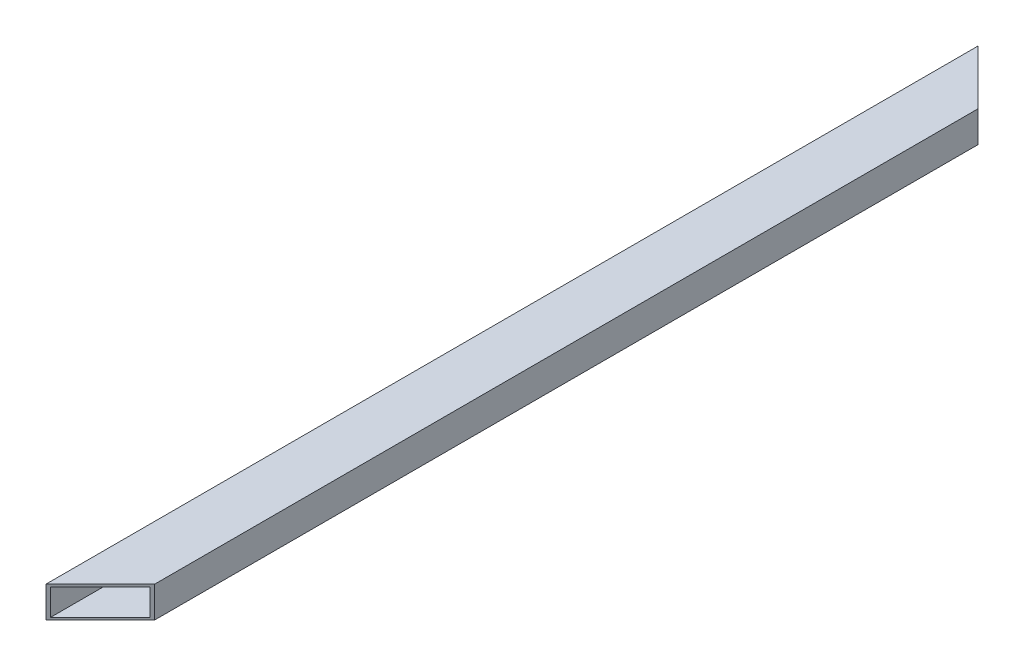
ISO-10303-21;
HEADER;
FILE_DESCRIPTION(('STEP AP214'),'2;1');
FILE_NAME('part.step','',(''),(''),'','','');
FILE_SCHEMA(('AUTOMOTIVE_DESIGN { 1 0 10303 214 1 1 1 1 }'));
ENDSEC;
DATA;
#1=APPLICATION_CONTEXT('core data for automotive mechanical design processes');
#2=APPLICATION_PROTOCOL_DEFINITION('international standard','automotive_design',2000,#1);
#3=PRODUCT_CONTEXT('',#1,'mechanical');
#4=PRODUCT('Part','Part','',(#3));
#5=PRODUCT_RELATED_PRODUCT_CATEGORY('part','',(#4));
#6=PRODUCT_DEFINITION_FORMATION('','',#4);
#7=PRODUCT_DEFINITION_CONTEXT('part definition',#1,'design');
#8=PRODUCT_DEFINITION('design','',#6,#7);
#9=PRODUCT_DEFINITION_SHAPE('','',#8);
#10=(LENGTH_UNIT() NAMED_UNIT(*) SI_UNIT(.MILLI.,.METRE.));
#11=(NAMED_UNIT(*) PLANE_ANGLE_UNIT() SI_UNIT($,.RADIAN.));
#12=(NAMED_UNIT(*) SI_UNIT($,.STERADIAN.) SOLID_ANGLE_UNIT());
#13=UNCERTAINTY_MEASURE_WITH_UNIT(LENGTH_MEASURE(1.E-05),#10,'distance_accuracy_value','');
#14=(GEOMETRIC_REPRESENTATION_CONTEXT(3) GLOBAL_UNCERTAINTY_ASSIGNED_CONTEXT((#13)) GLOBAL_UNIT_ASSIGNED_CONTEXT((#10,
#11,#12)) REPRESENTATION_CONTEXT('',''));
#15=CARTESIAN_POINT('',(0.,0.,0.));
#16=DIRECTION('',(0.,0.,1.));
#17=DIRECTION('',(1.,0.,0.));
#18=AXIS2_PLACEMENT_3D('',#15,#16,#17);
#19=CARTESIAN_POINT('',(0.,0.,600.));
#20=DIRECTION('',(0.,1.,0.));
#21=DIRECTION('',(0.,0.,1.));
#22=AXIS2_PLACEMENT_3D('',#19,#20,#21);
#23=PLANE('',#22);
#24=DIRECTION('',(0.707106781186557,0.,0.707106781186538));
#25=VECTOR('',#24,1.);
#26=CARTESIAN_POINT('',(0.,0.,0.));
#27=LINE('',#26,#25);
#28=CARTESIAN_POINT('',(0.,0.,0.));
#29=VERTEX_POINT('',#28);
#30=CARTESIAN_POINT('',(35.,0.,34.999999999999));
#31=VERTEX_POINT('',#30);
#32=EDGE_CURVE('E102',#29,#31,#27,.T.);
#33=ORIENTED_EDGE('',*,*,#32,.T.);
#34=DIRECTION('',(0.,0.,-1.));
#35=VECTOR('',#34,1.);
#36=CARTESIAN_POINT('',(35.,0.,600.));
#37=LINE('',#36,#35);
#38=CARTESIAN_POINT('',(35.,0.,565.));
#39=VERTEX_POINT('',#38);
#40=EDGE_CURVE('E121',#39,#31,#37,.T.);
#41=ORIENTED_EDGE('',*,*,#40,.F.);
#42=DIRECTION('',(-0.707106781186546,0.,0.707106781186549));
#43=VECTOR('',#42,1.);
#44=CARTESIAN_POINT('',(0.,0.,600.));
#45=LINE('',#44,#43);
#46=CARTESIAN_POINT('',(0.,0.,600.));
#47=VERTEX_POINT('',#46);
#48=EDGE_CURVE('E129',#39,#47,#45,.T.);
#49=ORIENTED_EDGE('',*,*,#48,.T.);
#50=DIRECTION('',(0.,0.,-1.));
#51=VECTOR('',#50,1.);
#52=CARTESIAN_POINT('',(0.,0.,600.));
#53=LINE('',#52,#51);
#54=EDGE_CURVE('E40',#47,#29,#53,.T.);
#55=ORIENTED_EDGE('',*,*,#54,.T.);
#56=EDGE_LOOP('',(#33,#41,#49,#55));
#57=FACE_BOUND('',#56,.T.);
#58=ADVANCED_FACE('F32',(#57),#23,.F.);
#59=CARTESIAN_POINT('',(35.,0.,600.));
#60=DIRECTION('',(-1.,0.,0.));
#61=DIRECTION('',(0.,-1.,0.));
#62=AXIS2_PLACEMENT_3D('',#59,#60,#61);
#63=PLANE('',#62);
#64=DIRECTION('',(0.,-1.,0.));
#65=VECTOR('',#64,1.);
#66=CARTESIAN_POINT('',(35.,20.,34.999999999999));
#67=LINE('',#66,#65);
#68=CARTESIAN_POINT('',(35.,20.,34.999999999999));
#69=VERTEX_POINT('',#68);
#70=EDGE_CURVE('E118',#69,#31,#67,.T.);
#71=ORIENTED_EDGE('',*,*,#70,.F.);
#72=DIRECTION('',(0.,0.,-1.));
#73=VECTOR('',#72,1.);
#74=CARTESIAN_POINT('',(35.,20.,600.));
#75=LINE('',#74,#73);
#76=CARTESIAN_POINT('',(35.,20.,565.));
#77=VERTEX_POINT('',#76);
#78=EDGE_CURVE('E117',#77,#69,#75,.T.);
#79=ORIENTED_EDGE('',*,*,#78,.F.);
#80=DIRECTION('',(0.,-1.,0.));
#81=VECTOR('',#80,1.);
#82=CARTESIAN_POINT('',(35.,20.,565.));
#83=LINE('',#82,#81);
#84=EDGE_CURVE('E55',#77,#39,#83,.T.);
#85=ORIENTED_EDGE('',*,*,#84,.T.);
#86=ORIENTED_EDGE('',*,*,#40,.T.);
#87=EDGE_LOOP('',(#71,#79,#85,#86));
#88=FACE_BOUND('',#87,.T.);
#89=ADVANCED_FACE('F173',(#88),#63,.F.);
#90=CARTESIAN_POINT('',(0.,20.,600.));
#91=DIRECTION('',(0.,-1.,0.));
#92=DIRECTION('',(0.,0.,-1.));
#93=AXIS2_PLACEMENT_3D('',#90,#91,#92);
#94=PLANE('',#93);
#95=DIRECTION('',(0.707106781186557,0.,0.707106781186538));
#96=VECTOR('',#95,1.);
#97=CARTESIAN_POINT('',(0.,20.,0.));
#98=LINE('',#97,#96);
#99=CARTESIAN_POINT('',(0.,20.,0.));
#100=VERTEX_POINT('',#99);
#101=EDGE_CURVE('E99',#100,#69,#98,.T.);
#102=ORIENTED_EDGE('',*,*,#101,.F.);
#103=DIRECTION('',(0.,0.,-1.));
#104=VECTOR('',#103,1.);
#105=CARTESIAN_POINT('',(0.,20.,600.));
#106=LINE('',#105,#104);
#107=CARTESIAN_POINT('',(0.,20.,600.));
#108=VERTEX_POINT('',#107);
#109=EDGE_CURVE('E114',#108,#100,#106,.T.);
#110=ORIENTED_EDGE('',*,*,#109,.F.);
#111=DIRECTION('',(-0.707106781186546,0.,0.707106781186549));
#112=VECTOR('',#111,1.);
#113=CARTESIAN_POINT('',(0.,20.,600.));
#114=LINE('',#113,#112);
#115=EDGE_CURVE('E130',#77,#108,#114,.T.);
#116=ORIENTED_EDGE('',*,*,#115,.F.);
#117=ORIENTED_EDGE('',*,*,#78,.T.);
#118=EDGE_LOOP('',(#102,#110,#116,#117));
#119=FACE_BOUND('',#118,.T.);
#120=ADVANCED_FACE('F113',(#119),#94,.F.);
#121=CARTESIAN_POINT('',(1.5,18.5,600.));
#122=DIRECTION('',(1.,0.,0.));
#123=DIRECTION('',(0.,1.,0.));
#124=AXIS2_PLACEMENT_3D('',#121,#122,#123);
#125=PLANE('',#124);
#126=DIRECTION('',(0.,0.,-1.));
#127=VECTOR('',#126,1.);
#128=CARTESIAN_POINT('',(1.5,1.5,600.));
#129=LINE('',#128,#127);
#130=CARTESIAN_POINT('',(1.5,1.5,598.5));
#131=VERTEX_POINT('',#130);
#132=CARTESIAN_POINT('',(1.50000000000006,1.5,1.5));
#133=VERTEX_POINT('',#132);
#134=EDGE_CURVE('E108',#131,#133,#129,.T.);
#135=ORIENTED_EDGE('',*,*,#134,.T.);
#136=DIRECTION('',(0.,1.,0.));
#137=VECTOR('',#136,1.);
#138=CARTESIAN_POINT('',(1.5,18.4999999999999,1.49999999999995));
#139=LINE('',#138,#137);
#140=CARTESIAN_POINT('',(1.50000000000006,18.5,1.5));
#141=VERTEX_POINT('',#140);
#142=EDGE_CURVE('E131',#133,#141,#139,.T.);
#143=ORIENTED_EDGE('',*,*,#142,.T.);
#144=DIRECTION('',(0.,0.,-1.));
#145=VECTOR('',#144,1.);
#146=CARTESIAN_POINT('',(1.5,18.5,600.));
#147=LINE('',#146,#145);
#148=CARTESIAN_POINT('',(1.5,18.5,598.5));
#149=VERTEX_POINT('',#148);
#150=EDGE_CURVE('E148',#149,#141,#147,.T.);
#151=ORIENTED_EDGE('',*,*,#150,.F.);
#152=DIRECTION('',(0.,-1.,0.));
#153=VECTOR('',#152,1.);
#154=CARTESIAN_POINT('',(1.5,18.5,598.5));
#155=LINE('',#154,#153);
#156=EDGE_CURVE('E145',#149,#131,#155,.T.);
#157=ORIENTED_EDGE('',*,*,#156,.T.);
#158=EDGE_LOOP('',(#135,#143,#151,#157));
#159=FACE_BOUND('',#158,.T.);
#160=ADVANCED_FACE('F160',(#159),#125,.T.);
#161=CARTESIAN_POINT('',(1.5,1.5,600.));
#162=DIRECTION('',(0.,1.,0.));
#163=DIRECTION('',(0.,0.,1.));
#164=AXIS2_PLACEMENT_3D('',#161,#162,#163);
#165=PLANE('',#164);
#166=DIRECTION('',(0.,0.,-1.));
#167=VECTOR('',#166,1.);
#168=CARTESIAN_POINT('',(33.5,1.5,600.));
#169=LINE('',#168,#167);
#170=CARTESIAN_POINT('',(33.5,1.5,566.5));
#171=VERTEX_POINT('',#170);
#172=CARTESIAN_POINT('',(33.5,1.5,33.4999999999991));
#173=VERTEX_POINT('',#172);
#174=EDGE_CURVE('E154',#171,#173,#169,.T.);
#175=ORIENTED_EDGE('',*,*,#174,.T.);
#176=DIRECTION('',(-0.707106781186557,0.,-0.707106781186538));
#177=VECTOR('',#176,1.);
#178=CARTESIAN_POINT('',(300.75,1.5,300.749999999992));
#179=LINE('',#178,#177);
#180=EDGE_CURVE('E135',#173,#133,#179,.T.);
#181=ORIENTED_EDGE('',*,*,#180,.T.);
#182=ORIENTED_EDGE('',*,*,#134,.F.);
#183=DIRECTION('',(0.707106781186546,0.,-0.707106781186549));
#184=VECTOR('',#183,1.);
#185=CARTESIAN_POINT('',(0.749999999999991,1.5,599.25));
#186=LINE('',#185,#184);
#187=EDGE_CURVE('E142',#131,#171,#186,.T.);
#188=ORIENTED_EDGE('',*,*,#187,.T.);
#189=EDGE_LOOP('',(#175,#181,#182,#188));
#190=FACE_BOUND('',#189,.T.);
#191=ADVANCED_FACE('F164',(#190),#165,.T.);
#192=CARTESIAN_POINT('',(33.5,18.5,600.));
#193=DIRECTION('',(-1.,0.,0.));
#194=DIRECTION('',(0.,0.,1.));
#195=AXIS2_PLACEMENT_3D('',#192,#193,#194);
#196=PLANE('',#195);
#197=DIRECTION('',(0.,0.,-1.));
#198=VECTOR('',#197,1.);
#199=CARTESIAN_POINT('',(33.5,18.5,600.));
#200=LINE('',#199,#198);
#201=CARTESIAN_POINT('',(33.5,18.5,566.5));
#202=VERTEX_POINT('',#201);
#203=CARTESIAN_POINT('',(33.5,18.5,33.499999999999));
#204=VERTEX_POINT('',#203);
#205=EDGE_CURVE('E151',#202,#204,#200,.T.);
#206=ORIENTED_EDGE('',*,*,#205,.T.);
#207=DIRECTION('',(0.,-1.,0.));
#208=VECTOR('',#207,1.);
#209=CARTESIAN_POINT('',(33.5,18.5,33.4999999999991));
#210=LINE('',#209,#208);
#211=EDGE_CURVE('E47',#204,#173,#210,.T.);
#212=ORIENTED_EDGE('',*,*,#211,.T.);
#213=ORIENTED_EDGE('',*,*,#174,.F.);
#214=DIRECTION('',(0.,1.,0.));
#215=VECTOR('',#214,1.);
#216=CARTESIAN_POINT('',(33.5,18.5,566.5));
#217=LINE('',#216,#215);
#218=EDGE_CURVE('E139',#171,#202,#217,.T.);
#219=ORIENTED_EDGE('',*,*,#218,.T.);
#220=EDGE_LOOP('',(#206,#212,#213,#219));
#221=FACE_BOUND('',#220,.T.);
#222=ADVANCED_FACE('F186',(#221),#196,.T.);
#223=CARTESIAN_POINT('',(1.5,18.5,600.));
#224=DIRECTION('',(0.,-1.,0.));
#225=DIRECTION('',(0.,0.,-1.));
#226=AXIS2_PLACEMENT_3D('',#223,#224,#225);
#227=PLANE('',#226);
#228=ORIENTED_EDGE('',*,*,#150,.T.);
#229=DIRECTION('',(0.707106781186557,0.,0.707106781186538));
#230=VECTOR('',#229,1.);
#231=CARTESIAN_POINT('',(300.75,18.5,300.749999999992));
#232=LINE('',#231,#230);
#233=EDGE_CURVE('E167',#141,#204,#232,.T.);
#234=ORIENTED_EDGE('',*,*,#233,.T.);
#235=ORIENTED_EDGE('',*,*,#205,.F.);
#236=DIRECTION('',(-0.707106781186546,0.,0.707106781186549));
#237=VECTOR('',#236,1.);
#238=CARTESIAN_POINT('',(0.74999999999999,18.5,599.25));
#239=LINE('',#238,#237);
#240=EDGE_CURVE('E11',#202,#149,#239,.T.);
#241=ORIENTED_EDGE('',*,*,#240,.T.);
#242=EDGE_LOOP('',(#228,#234,#235,#241));
#243=FACE_BOUND('',#242,.T.);
#244=ADVANCED_FACE('F189',(#243),#227,.T.);
#245=CARTESIAN_POINT('',(0.,0.,600.));
#246=DIRECTION('',(1.,0.,0.));
#247=DIRECTION('',(0.,1.,0.));
#248=AXIS2_PLACEMENT_3D('',#245,#246,#247);
#249=PLANE('',#248);
#250=DIRECTION('',(0.,-1.,0.));
#251=VECTOR('',#250,1.);
#252=CARTESIAN_POINT('',(0.,0.,0.));
#253=LINE('',#252,#251);
#254=EDGE_CURVE('E96',#100,#29,#253,.T.);
#255=ORIENTED_EDGE('',*,*,#254,.T.);
#256=ORIENTED_EDGE('',*,*,#54,.F.);
#257=DIRECTION('',(0.,-1.,0.));
#258=VECTOR('',#257,1.);
#259=CARTESIAN_POINT('',(0.,0.,600.));
#260=LINE('',#259,#258);
#261=EDGE_CURVE('E107',#108,#47,#260,.T.);
#262=ORIENTED_EDGE('',*,*,#261,.F.);
#263=ORIENTED_EDGE('',*,*,#109,.T.);
#264=EDGE_LOOP('',(#255,#256,#262,#263));
#265=FACE_BOUND('',#264,.T.);
#266=ADVANCED_FACE('F34',(#265),#249,.F.);
#267=CARTESIAN_POINT('',(0.,20.,600.));
#268=DIRECTION('',(0.707106781186549,0.,0.707106781186546));
#269=DIRECTION('',(0.707106781186546,0.,-0.707106781186549));
#270=AXIS2_PLACEMENT_3D('',#267,#268,#269);
#271=PLANE('',#270);
#272=ORIENTED_EDGE('',*,*,#240,.F.);
#273=ORIENTED_EDGE('',*,*,#218,.F.);
#274=ORIENTED_EDGE('',*,*,#187,.F.);
#275=ORIENTED_EDGE('',*,*,#156,.F.);
#276=EDGE_LOOP('',(#272,#273,#274,#275));
#277=FACE_BOUND('',#276,.T.);
#278=ORIENTED_EDGE('',*,*,#48,.F.);
#279=ORIENTED_EDGE('',*,*,#84,.F.);
#280=ORIENTED_EDGE('',*,*,#115,.T.);
#281=ORIENTED_EDGE('',*,*,#261,.T.);
#282=EDGE_LOOP('',(#278,#279,#280,#281));
#283=FACE_BOUND('',#282,.T.);
#284=ADVANCED_FACE('F194',(#277,#283),#271,.T.);
#285=CARTESIAN_POINT('',(0.,20.,0.));
#286=DIRECTION('',(0.707106781186538,0.,-0.707106781186557));
#287=DIRECTION('',(-0.707106781186557,0.,-0.707106781186538));
#288=AXIS2_PLACEMENT_3D('',#285,#286,#287);
#289=PLANE('',#288);
#290=ORIENTED_EDGE('',*,*,#180,.F.);
#291=ORIENTED_EDGE('',*,*,#211,.F.);
#292=ORIENTED_EDGE('',*,*,#233,.F.);
#293=ORIENTED_EDGE('',*,*,#142,.F.);
#294=EDGE_LOOP('',(#290,#291,#292,#293));
#295=FACE_BOUND('',#294,.T.);
#296=ORIENTED_EDGE('',*,*,#32,.F.);
#297=ORIENTED_EDGE('',*,*,#254,.F.);
#298=ORIENTED_EDGE('',*,*,#101,.T.);
#299=ORIENTED_EDGE('',*,*,#70,.T.);
#300=EDGE_LOOP('',(#296,#297,#298,#299));
#301=FACE_BOUND('',#300,.T.);
#302=ADVANCED_FACE('F98',(#295,#301),#289,.T.);
#303=CLOSED_SHELL('',(#58,#89,#120,#160,#191,#222,#244,#266,#284,#302));
#304=MANIFOLD_SOLID_BREP('B2',#303);
#305=ADVANCED_BREP_SHAPE_REPRESENTATION('',(#18,#304),#14);
#306=SHAPE_DEFINITION_REPRESENTATION(#9,#305);
ENDSEC;
END-ISO-10303-21;
